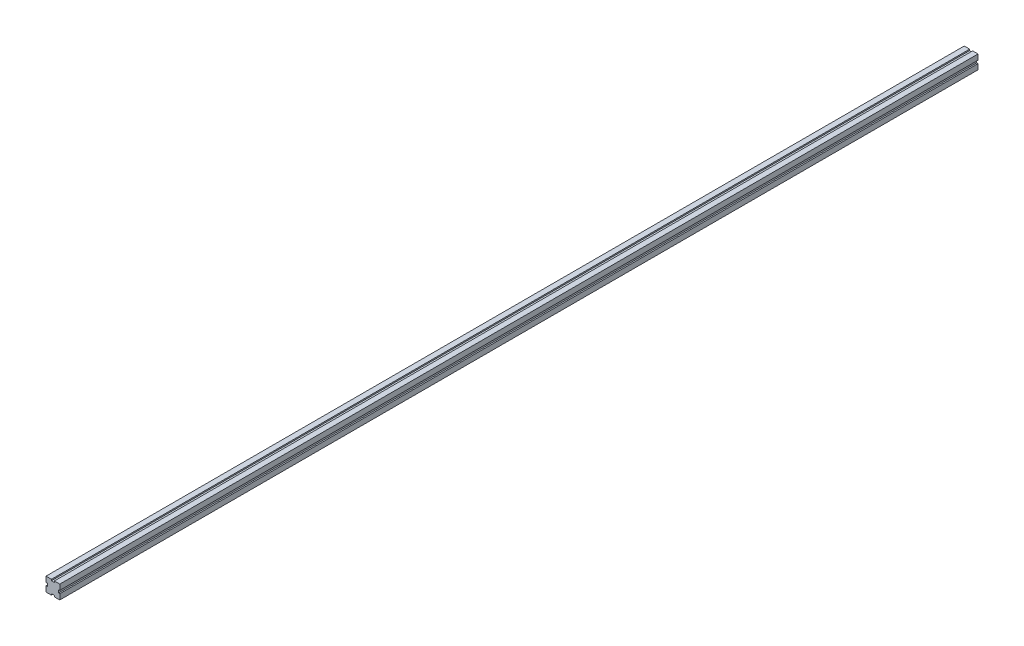
ISO-10303-21;
HEADER;
FILE_DESCRIPTION(('STEP AP214'),'2;1');
FILE_NAME('part.step','',(''),(''),'','','');
FILE_SCHEMA(('AUTOMOTIVE_DESIGN { 1 0 10303 214 1 1 1 1 }'));
ENDSEC;
DATA;
#1=APPLICATION_CONTEXT('core data for automotive mechanical design processes');
#2=APPLICATION_PROTOCOL_DEFINITION('international standard','automotive_design',2000,#1);
#3=PRODUCT_CONTEXT('',#1,'mechanical');
#4=PRODUCT('Part','Part','',(#3));
#5=PRODUCT_RELATED_PRODUCT_CATEGORY('part','',(#4));
#6=PRODUCT_DEFINITION_FORMATION('','',#4);
#7=PRODUCT_DEFINITION_CONTEXT('part definition',#1,'design');
#8=PRODUCT_DEFINITION('design','',#6,#7);
#9=PRODUCT_DEFINITION_SHAPE('','',#8);
#10=(LENGTH_UNIT() NAMED_UNIT(*) SI_UNIT(.MILLI.,.METRE.));
#11=(NAMED_UNIT(*) PLANE_ANGLE_UNIT() SI_UNIT($,.RADIAN.));
#12=(NAMED_UNIT(*) SI_UNIT($,.STERADIAN.) SOLID_ANGLE_UNIT());
#13=UNCERTAINTY_MEASURE_WITH_UNIT(LENGTH_MEASURE(1.E-05),#10,'distance_accuracy_value','');
#14=(GEOMETRIC_REPRESENTATION_CONTEXT(3) GLOBAL_UNCERTAINTY_ASSIGNED_CONTEXT((#13)) GLOBAL_UNIT_ASSIGNED_CONTEXT((#10,
#11,#12)) REPRESENTATION_CONTEXT('',''));
#15=CARTESIAN_POINT('',(0.,0.,0.));
#16=DIRECTION('',(0.,0.,1.));
#17=DIRECTION('',(1.,0.,0.));
#18=AXIS2_PLACEMENT_3D('',#15,#16,#17);
#19=CARTESIAN_POINT('',(-7.5,1.6,1000.));
#20=DIRECTION('',(1.,0.,0.));
#21=DIRECTION('',(0.,0.,-1.));
#22=AXIS2_PLACEMENT_3D('',#19,#20,#21);
#23=PLANE('',#22);
#24=DIRECTION('',(0.,-1.,0.));
#25=VECTOR('',#24,1.);
#26=CARTESIAN_POINT('',(-7.5,1.6,0.));
#27=LINE('',#26,#25);
#28=CARTESIAN_POINT('',(-7.5,7.5,0.));
#29=VERTEX_POINT('',#28);
#30=CARTESIAN_POINT('',(-7.5,1.6,0.));
#31=VERTEX_POINT('',#30);
#32=EDGE_CURVE('E201',#29,#31,#27,.T.);
#33=ORIENTED_EDGE('',*,*,#32,.T.);
#34=DIRECTION('',(0.,0.,-1.));
#35=VECTOR('',#34,1.);
#36=CARTESIAN_POINT('',(-7.5,1.6,1000.));
#37=LINE('',#36,#35);
#38=CARTESIAN_POINT('',(-7.5,1.6,1000.));
#39=VERTEX_POINT('',#38);
#40=EDGE_CURVE('E11',#39,#31,#37,.T.);
#41=ORIENTED_EDGE('',*,*,#40,.F.);
#42=DIRECTION('',(0.,-1.,0.));
#43=VECTOR('',#42,1.);
#44=CARTESIAN_POINT('',(-7.5,1.6,1000.));
#45=LINE('',#44,#43);
#46=CARTESIAN_POINT('',(-7.5,7.5,1000.));
#47=VERTEX_POINT('',#46);
#48=EDGE_CURVE('E240',#47,#39,#45,.T.);
#49=ORIENTED_EDGE('',*,*,#48,.F.);
#50=DIRECTION('',(0.,0.,-1.));
#51=VECTOR('',#50,1.);
#52=CARTESIAN_POINT('',(-7.5,7.5,1000.));
#53=LINE('',#52,#51);
#54=EDGE_CURVE('E197',#47,#29,#53,.T.);
#55=ORIENTED_EDGE('',*,*,#54,.T.);
#56=EDGE_LOOP('',(#33,#41,#49,#55));
#57=FACE_BOUND('',#56,.T.);
#58=ADVANCED_FACE('F33',(#57),#23,.F.);
#59=CARTESIAN_POINT('',(-6.1,1.6,1000.));
#60=DIRECTION('',(0.,1.,0.));
#61=DIRECTION('',(0.,0.,1.));
#62=AXIS2_PLACEMENT_3D('',#59,#60,#61);
#63=PLANE('',#62);
#64=DIRECTION('',(1.,0.,0.));
#65=VECTOR('',#64,1.);
#66=CARTESIAN_POINT('',(-6.1,1.6,0.));
#67=LINE('',#66,#65);
#68=CARTESIAN_POINT('',(-6.1,1.6,0.));
#69=VERTEX_POINT('',#68);
#70=EDGE_CURVE('E204',#31,#69,#67,.T.);
#71=ORIENTED_EDGE('',*,*,#70,.T.);
#72=DIRECTION('',(0.,0.,-1.));
#73=VECTOR('',#72,1.);
#74=CARTESIAN_POINT('',(-6.1,1.6,1000.));
#75=LINE('',#74,#73);
#76=CARTESIAN_POINT('',(-6.1,1.6,1000.));
#77=VERTEX_POINT('',#76);
#78=EDGE_CURVE('E41',#77,#69,#75,.T.);
#79=ORIENTED_EDGE('',*,*,#78,.F.);
#80=DIRECTION('',(1.,0.,0.));
#81=VECTOR('',#80,1.);
#82=CARTESIAN_POINT('',(-6.1,1.6,1000.));
#83=LINE('',#82,#81);
#84=EDGE_CURVE('E128',#39,#77,#83,.T.);
#85=ORIENTED_EDGE('',*,*,#84,.F.);
#86=ORIENTED_EDGE('',*,*,#40,.T.);
#87=EDGE_LOOP('',(#71,#79,#85,#86));
#88=FACE_BOUND('',#87,.T.);
#89=ADVANCED_FACE('F357',(#88),#63,.F.);
#90=CARTESIAN_POINT('',(-6.1,-1.6,1000.));
#91=DIRECTION('',(1.,0.,0.));
#92=DIRECTION('',(0.,0.,-1.));
#93=AXIS2_PLACEMENT_3D('',#90,#91,#92);
#94=PLANE('',#93);
#95=DIRECTION('',(0.,-1.,0.));
#96=VECTOR('',#95,1.);
#97=CARTESIAN_POINT('',(-6.1,-1.6,0.));
#98=LINE('',#97,#96);
#99=CARTESIAN_POINT('',(-6.1,-1.6,0.));
#100=VERTEX_POINT('',#99);
#101=EDGE_CURVE('E206',#69,#100,#98,.T.);
#102=ORIENTED_EDGE('',*,*,#101,.T.);
#103=DIRECTION('',(0.,0.,-1.));
#104=VECTOR('',#103,1.);
#105=CARTESIAN_POINT('',(-6.1,-1.6,1000.));
#106=LINE('',#105,#104);
#107=CARTESIAN_POINT('',(-6.1,-1.6,1000.));
#108=VERTEX_POINT('',#107);
#109=EDGE_CURVE('E283',#108,#100,#106,.T.);
#110=ORIENTED_EDGE('',*,*,#109,.F.);
#111=DIRECTION('',(0.,-1.,0.));
#112=VECTOR('',#111,1.);
#113=CARTESIAN_POINT('',(-6.1,-1.6,1000.));
#114=LINE('',#113,#112);
#115=EDGE_CURVE('E291',#77,#108,#114,.T.);
#116=ORIENTED_EDGE('',*,*,#115,.F.);
#117=ORIENTED_EDGE('',*,*,#78,.T.);
#118=EDGE_LOOP('',(#102,#110,#116,#117));
#119=FACE_BOUND('',#118,.T.);
#120=ADVANCED_FACE('F289',(#119),#94,.F.);
#121=CARTESIAN_POINT('',(-7.5,-1.6,1000.));
#122=DIRECTION('',(0.,-1.,0.));
#123=DIRECTION('',(0.,0.,-1.));
#124=AXIS2_PLACEMENT_3D('',#121,#122,#123);
#125=PLANE('',#124);
#126=DIRECTION('',(-1.,0.,0.));
#127=VECTOR('',#126,1.);
#128=CARTESIAN_POINT('',(-7.5,-1.6,0.));
#129=LINE('',#128,#127);
#130=CARTESIAN_POINT('',(-7.5,-1.6,0.));
#131=VERTEX_POINT('',#130);
#132=EDGE_CURVE('E208',#100,#131,#129,.T.);
#133=ORIENTED_EDGE('',*,*,#132,.T.);
#134=DIRECTION('',(0.,0.,-1.));
#135=VECTOR('',#134,1.);
#136=CARTESIAN_POINT('',(-7.5,-1.6,1000.));
#137=LINE('',#136,#135);
#138=CARTESIAN_POINT('',(-7.5,-1.6,1000.));
#139=VERTEX_POINT('',#138);
#140=EDGE_CURVE('E280',#139,#131,#137,.T.);
#141=ORIENTED_EDGE('',*,*,#140,.F.);
#142=DIRECTION('',(-1.,0.,0.));
#143=VECTOR('',#142,1.);
#144=CARTESIAN_POINT('',(-7.5,-1.6,1000.));
#145=LINE('',#144,#143);
#146=EDGE_CURVE('E309',#108,#139,#145,.T.);
#147=ORIENTED_EDGE('',*,*,#146,.F.);
#148=ORIENTED_EDGE('',*,*,#109,.T.);
#149=EDGE_LOOP('',(#133,#141,#147,#148));
#150=FACE_BOUND('',#149,.T.);
#151=ADVANCED_FACE('F300',(#150),#125,.F.);
#152=CARTESIAN_POINT('',(-7.5,-7.5,1000.));
#153=DIRECTION('',(1.,0.,0.));
#154=DIRECTION('',(0.,0.,-1.));
#155=AXIS2_PLACEMENT_3D('',#152,#153,#154);
#156=PLANE('',#155);
#157=DIRECTION('',(0.,-1.,0.));
#158=VECTOR('',#157,1.);
#159=CARTESIAN_POINT('',(-7.5,-7.5,0.));
#160=LINE('',#159,#158);
#161=CARTESIAN_POINT('',(-7.5,-7.5,0.));
#162=VERTEX_POINT('',#161);
#163=EDGE_CURVE('E210',#131,#162,#160,.T.);
#164=ORIENTED_EDGE('',*,*,#163,.T.);
#165=DIRECTION('',(0.,0.,-1.));
#166=VECTOR('',#165,1.);
#167=CARTESIAN_POINT('',(-7.5,-7.5,1000.));
#168=LINE('',#167,#166);
#169=CARTESIAN_POINT('',(-7.5,-7.5,1000.));
#170=VERTEX_POINT('',#169);
#171=EDGE_CURVE('E277',#170,#162,#168,.T.);
#172=ORIENTED_EDGE('',*,*,#171,.F.);
#173=DIRECTION('',(0.,-1.,0.));
#174=VECTOR('',#173,1.);
#175=CARTESIAN_POINT('',(-7.5,-7.5,1000.));
#176=LINE('',#175,#174);
#177=EDGE_CURVE('E306',#139,#170,#176,.T.);
#178=ORIENTED_EDGE('',*,*,#177,.F.);
#179=ORIENTED_EDGE('',*,*,#140,.T.);
#180=EDGE_LOOP('',(#164,#172,#178,#179));
#181=FACE_BOUND('',#180,.T.);
#182=ADVANCED_FACE('F304',(#181),#156,.F.);
#183=CARTESIAN_POINT('',(-1.6,-7.5,1000.));
#184=DIRECTION('',(0.,1.,0.));
#185=DIRECTION('',(0.,0.,1.));
#186=AXIS2_PLACEMENT_3D('',#183,#184,#185);
#187=PLANE('',#186);
#188=DIRECTION('',(1.,0.,0.));
#189=VECTOR('',#188,1.);
#190=CARTESIAN_POINT('',(-1.6,-7.5,0.));
#191=LINE('',#190,#189);
#192=CARTESIAN_POINT('',(-1.6,-7.5,0.));
#193=VERTEX_POINT('',#192);
#194=EDGE_CURVE('E212',#162,#193,#191,.T.);
#195=ORIENTED_EDGE('',*,*,#194,.T.);
#196=DIRECTION('',(0.,0.,-1.));
#197=VECTOR('',#196,1.);
#198=CARTESIAN_POINT('',(-1.6,-7.5,1000.));
#199=LINE('',#198,#197);
#200=CARTESIAN_POINT('',(-1.6,-7.5,1000.));
#201=VERTEX_POINT('',#200);
#202=EDGE_CURVE('E274',#201,#193,#199,.T.);
#203=ORIENTED_EDGE('',*,*,#202,.F.);
#204=DIRECTION('',(1.,0.,0.));
#205=VECTOR('',#204,1.);
#206=CARTESIAN_POINT('',(-1.6,-7.5,1000.));
#207=LINE('',#206,#205);
#208=EDGE_CURVE('E308',#170,#201,#207,.T.);
#209=ORIENTED_EDGE('',*,*,#208,.F.);
#210=ORIENTED_EDGE('',*,*,#171,.T.);
#211=EDGE_LOOP('',(#195,#203,#209,#210));
#212=FACE_BOUND('',#211,.T.);
#213=ADVANCED_FACE('F370',(#212),#187,.F.);
#214=CARTESIAN_POINT('',(-1.6,-6.09999999999998,1000.));
#215=DIRECTION('',(-1.,0.,0.));
#216=DIRECTION('',(0.,-1.,0.));
#217=AXIS2_PLACEMENT_3D('',#214,#215,#216);
#218=PLANE('',#217);
#219=DIRECTION('',(0.,1.,0.));
#220=VECTOR('',#219,1.);
#221=CARTESIAN_POINT('',(-1.6,-6.09999999999998,0.));
#222=LINE('',#221,#220);
#223=CARTESIAN_POINT('',(-1.6,-6.09999999999998,0.));
#224=VERTEX_POINT('',#223);
#225=EDGE_CURVE('E214',#193,#224,#222,.T.);
#226=ORIENTED_EDGE('',*,*,#225,.T.);
#227=DIRECTION('',(0.,0.,-1.));
#228=VECTOR('',#227,1.);
#229=CARTESIAN_POINT('',(-1.6,-6.09999999999998,1000.));
#230=LINE('',#229,#228);
#231=CARTESIAN_POINT('',(-1.6,-6.09999999999998,1000.));
#232=VERTEX_POINT('',#231);
#233=EDGE_CURVE('E271',#232,#224,#230,.T.);
#234=ORIENTED_EDGE('',*,*,#233,.F.);
#235=DIRECTION('',(0.,1.,0.));
#236=VECTOR('',#235,1.);
#237=CARTESIAN_POINT('',(-1.6,-6.09999999999998,1000.));
#238=LINE('',#237,#236);
#239=EDGE_CURVE('E311',#201,#232,#238,.T.);
#240=ORIENTED_EDGE('',*,*,#239,.F.);
#241=ORIENTED_EDGE('',*,*,#202,.T.);
#242=EDGE_LOOP('',(#226,#234,#240,#241));
#243=FACE_BOUND('',#242,.T.);
#244=ADVANCED_FACE('F373',(#243),#218,.F.);
#245=CARTESIAN_POINT('',(1.6,-6.09999999999997,1000.));
#246=DIRECTION('',(0.,1.,0.));
#247=DIRECTION('',(-1.,0.,0.));
#248=AXIS2_PLACEMENT_3D('',#245,#246,#247);
#249=PLANE('',#248);
#250=DIRECTION('',(1.,0.,0.));
#251=VECTOR('',#250,1.);
#252=CARTESIAN_POINT('',(1.6,-6.09999999999997,0.));
#253=LINE('',#252,#251);
#254=CARTESIAN_POINT('',(1.6,-6.09999999999997,0.));
#255=VERTEX_POINT('',#254);
#256=EDGE_CURVE('E216',#224,#255,#253,.T.);
#257=ORIENTED_EDGE('',*,*,#256,.T.);
#258=DIRECTION('',(0.,0.,-1.));
#259=VECTOR('',#258,1.);
#260=CARTESIAN_POINT('',(1.6,-6.09999999999997,1000.));
#261=LINE('',#260,#259);
#262=CARTESIAN_POINT('',(1.6,-6.09999999999997,1000.));
#263=VERTEX_POINT('',#262);
#264=EDGE_CURVE('E268',#263,#255,#261,.T.);
#265=ORIENTED_EDGE('',*,*,#264,.F.);
#266=DIRECTION('',(1.,0.,0.));
#267=VECTOR('',#266,1.);
#268=CARTESIAN_POINT('',(1.6,-6.09999999999997,1000.));
#269=LINE('',#268,#267);
#270=EDGE_CURVE('E317',#232,#263,#269,.T.);
#271=ORIENTED_EDGE('',*,*,#270,.F.);
#272=ORIENTED_EDGE('',*,*,#233,.T.);
#273=EDGE_LOOP('',(#257,#265,#271,#272));
#274=FACE_BOUND('',#273,.T.);
#275=ADVANCED_FACE('F377',(#274),#249,.F.);
#276=CARTESIAN_POINT('',(1.6,-7.5,1000.));
#277=DIRECTION('',(1.,0.,0.));
#278=DIRECTION('',(0.,1.,0.));
#279=AXIS2_PLACEMENT_3D('',#276,#277,#278);
#280=PLANE('',#279);
#281=DIRECTION('',(0.,-1.,0.));
#282=VECTOR('',#281,1.);
#283=CARTESIAN_POINT('',(1.6,-7.5,0.));
#284=LINE('',#283,#282);
#285=CARTESIAN_POINT('',(1.6,-7.5,0.));
#286=VERTEX_POINT('',#285);
#287=EDGE_CURVE('E218',#255,#286,#284,.T.);
#288=ORIENTED_EDGE('',*,*,#287,.T.);
#289=DIRECTION('',(0.,0.,-1.));
#290=VECTOR('',#289,1.);
#291=CARTESIAN_POINT('',(1.6,-7.5,1000.));
#292=LINE('',#291,#290);
#293=CARTESIAN_POINT('',(1.6,-7.5,1000.));
#294=VERTEX_POINT('',#293);
#295=EDGE_CURVE('E265',#294,#286,#292,.T.);
#296=ORIENTED_EDGE('',*,*,#295,.F.);
#297=DIRECTION('',(0.,-1.,0.));
#298=VECTOR('',#297,1.);
#299=CARTESIAN_POINT('',(1.6,-7.5,1000.));
#300=LINE('',#299,#298);
#301=EDGE_CURVE('E319',#263,#294,#300,.T.);
#302=ORIENTED_EDGE('',*,*,#301,.F.);
#303=ORIENTED_EDGE('',*,*,#264,.T.);
#304=EDGE_LOOP('',(#288,#296,#302,#303));
#305=FACE_BOUND('',#304,.T.);
#306=ADVANCED_FACE('F381',(#305),#280,.F.);
#307=CARTESIAN_POINT('',(7.5,-7.5,1000.));
#308=DIRECTION('',(0.,1.,0.));
#309=DIRECTION('',(0.,0.,1.));
#310=AXIS2_PLACEMENT_3D('',#307,#308,#309);
#311=PLANE('',#310);
#312=DIRECTION('',(1.,0.,0.));
#313=VECTOR('',#312,1.);
#314=CARTESIAN_POINT('',(7.5,-7.5,0.));
#315=LINE('',#314,#313);
#316=CARTESIAN_POINT('',(7.5,-7.5,0.));
#317=VERTEX_POINT('',#316);
#318=EDGE_CURVE('E220',#286,#317,#315,.T.);
#319=ORIENTED_EDGE('',*,*,#318,.T.);
#320=DIRECTION('',(0.,0.,-1.));
#321=VECTOR('',#320,1.);
#322=CARTESIAN_POINT('',(7.5,-7.5,1000.));
#323=LINE('',#322,#321);
#324=CARTESIAN_POINT('',(7.5,-7.5,1000.));
#325=VERTEX_POINT('',#324);
#326=EDGE_CURVE('E262',#325,#317,#323,.T.);
#327=ORIENTED_EDGE('',*,*,#326,.F.);
#328=DIRECTION('',(1.,0.,0.));
#329=VECTOR('',#328,1.);
#330=CARTESIAN_POINT('',(7.5,-7.5,1000.));
#331=LINE('',#330,#329);
#332=EDGE_CURVE('E321',#294,#325,#331,.T.);
#333=ORIENTED_EDGE('',*,*,#332,.F.);
#334=ORIENTED_EDGE('',*,*,#295,.T.);
#335=EDGE_LOOP('',(#319,#327,#333,#334));
#336=FACE_BOUND('',#335,.T.);
#337=ADVANCED_FACE('F385',(#336),#311,.F.);
#338=CARTESIAN_POINT('',(7.5,-1.60000000000004,1000.));
#339=DIRECTION('',(-1.,0.,0.));
#340=DIRECTION('',(0.,0.,1.));
#341=AXIS2_PLACEMENT_3D('',#338,#339,#340);
#342=PLANE('',#341);
#343=DIRECTION('',(0.,1.,0.));
#344=VECTOR('',#343,1.);
#345=CARTESIAN_POINT('',(7.5,-1.60000000000004,0.));
#346=LINE('',#345,#344);
#347=CARTESIAN_POINT('',(7.5,-1.60000000000004,0.));
#348=VERTEX_POINT('',#347);
#349=EDGE_CURVE('E222',#317,#348,#346,.T.);
#350=ORIENTED_EDGE('',*,*,#349,.T.);
#351=DIRECTION('',(0.,0.,-1.));
#352=VECTOR('',#351,1.);
#353=CARTESIAN_POINT('',(7.5,-1.60000000000004,1000.));
#354=LINE('',#353,#352);
#355=CARTESIAN_POINT('',(7.5,-1.60000000000004,1000.));
#356=VERTEX_POINT('',#355);
#357=EDGE_CURVE('E259',#356,#348,#354,.T.);
#358=ORIENTED_EDGE('',*,*,#357,.F.);
#359=DIRECTION('',(0.,1.,0.));
#360=VECTOR('',#359,1.);
#361=CARTESIAN_POINT('',(7.5,-1.60000000000004,1000.));
#362=LINE('',#361,#360);
#363=EDGE_CURVE('E323',#325,#356,#362,.T.);
#364=ORIENTED_EDGE('',*,*,#363,.F.);
#365=ORIENTED_EDGE('',*,*,#326,.T.);
#366=EDGE_LOOP('',(#350,#358,#364,#365));
#367=FACE_BOUND('',#366,.T.);
#368=ADVANCED_FACE('F389',(#367),#342,.F.);
#369=CARTESIAN_POINT('',(6.09999999999994,-1.60000000000004,1000.));
#370=DIRECTION('',(0.,-1.,0.));
#371=DIRECTION('',(1.,0.,0.));
#372=AXIS2_PLACEMENT_3D('',#369,#370,#371);
#373=PLANE('',#372);
#374=DIRECTION('',(-1.,0.,0.));
#375=VECTOR('',#374,1.);
#376=CARTESIAN_POINT('',(6.09999999999994,-1.60000000000004,0.));
#377=LINE('',#376,#375);
#378=CARTESIAN_POINT('',(6.09999999999994,-1.60000000000004,0.));
#379=VERTEX_POINT('',#378);
#380=EDGE_CURVE('E224',#348,#379,#377,.T.);
#381=ORIENTED_EDGE('',*,*,#380,.T.);
#382=DIRECTION('',(0.,0.,-1.));
#383=VECTOR('',#382,1.);
#384=CARTESIAN_POINT('',(6.09999999999994,-1.60000000000004,1000.));
#385=LINE('',#384,#383);
#386=CARTESIAN_POINT('',(6.09999999999994,-1.60000000000004,1000.));
#387=VERTEX_POINT('',#386);
#388=EDGE_CURVE('E256',#387,#379,#385,.T.);
#389=ORIENTED_EDGE('',*,*,#388,.F.);
#390=DIRECTION('',(-1.,0.,0.));
#391=VECTOR('',#390,1.);
#392=CARTESIAN_POINT('',(6.09999999999994,-1.60000000000004,1000.));
#393=LINE('',#392,#391);
#394=EDGE_CURVE('E325',#356,#387,#393,.T.);
#395=ORIENTED_EDGE('',*,*,#394,.F.);
#396=ORIENTED_EDGE('',*,*,#357,.T.);
#397=EDGE_LOOP('',(#381,#389,#395,#396));
#398=FACE_BOUND('',#397,.T.);
#399=ADVANCED_FACE('F393',(#398),#373,.F.);
#400=CARTESIAN_POINT('',(6.09999999999997,1.59999999999996,1000.));
#401=DIRECTION('',(-1.,0.,0.));
#402=DIRECTION('',(0.,-1.,0.));
#403=AXIS2_PLACEMENT_3D('',#400,#401,#402);
#404=PLANE('',#403);
#405=DIRECTION('',(0.,1.,0.));
#406=VECTOR('',#405,1.);
#407=CARTESIAN_POINT('',(6.09999999999997,1.59999999999996,0.));
#408=LINE('',#407,#406);
#409=CARTESIAN_POINT('',(6.09999999999997,1.59999999999996,0.));
#410=VERTEX_POINT('',#409);
#411=EDGE_CURVE('E226',#379,#410,#408,.T.);
#412=ORIENTED_EDGE('',*,*,#411,.T.);
#413=DIRECTION('',(0.,0.,-1.));
#414=VECTOR('',#413,1.);
#415=CARTESIAN_POINT('',(6.09999999999997,1.59999999999996,1000.));
#416=LINE('',#415,#414);
#417=CARTESIAN_POINT('',(6.09999999999997,1.59999999999996,1000.));
#418=VERTEX_POINT('',#417);
#419=EDGE_CURVE('E253',#418,#410,#416,.T.);
#420=ORIENTED_EDGE('',*,*,#419,.F.);
#421=DIRECTION('',(0.,1.,0.));
#422=VECTOR('',#421,1.);
#423=CARTESIAN_POINT('',(6.09999999999997,1.59999999999996,1000.));
#424=LINE('',#423,#422);
#425=EDGE_CURVE('E327',#387,#418,#424,.T.);
#426=ORIENTED_EDGE('',*,*,#425,.F.);
#427=ORIENTED_EDGE('',*,*,#388,.T.);
#428=EDGE_LOOP('',(#412,#420,#426,#427));
#429=FACE_BOUND('',#428,.T.);
#430=ADVANCED_FACE('F397',(#429),#404,.F.);
#431=CARTESIAN_POINT('',(7.5,1.59999999999996,1000.));
#432=DIRECTION('',(0.,1.,0.));
#433=DIRECTION('',(-1.,0.,0.));
#434=AXIS2_PLACEMENT_3D('',#431,#432,#433);
#435=PLANE('',#434);
#436=DIRECTION('',(1.,0.,0.));
#437=VECTOR('',#436,1.);
#438=CARTESIAN_POINT('',(7.5,1.59999999999996,0.));
#439=LINE('',#438,#437);
#440=CARTESIAN_POINT('',(7.5,1.59999999999996,0.));
#441=VERTEX_POINT('',#440);
#442=EDGE_CURVE('E228',#410,#441,#439,.T.);
#443=ORIENTED_EDGE('',*,*,#442,.T.);
#444=DIRECTION('',(0.,0.,-1.));
#445=VECTOR('',#444,1.);
#446=CARTESIAN_POINT('',(7.5,1.59999999999996,1000.));
#447=LINE('',#446,#445);
#448=CARTESIAN_POINT('',(7.5,1.59999999999996,1000.));
#449=VERTEX_POINT('',#448);
#450=EDGE_CURVE('E250',#449,#441,#447,.T.);
#451=ORIENTED_EDGE('',*,*,#450,.F.);
#452=DIRECTION('',(1.,0.,0.));
#453=VECTOR('',#452,1.);
#454=CARTESIAN_POINT('',(7.5,1.59999999999996,1000.));
#455=LINE('',#454,#453);
#456=EDGE_CURVE('E329',#418,#449,#455,.T.);
#457=ORIENTED_EDGE('',*,*,#456,.F.);
#458=ORIENTED_EDGE('',*,*,#419,.T.);
#459=EDGE_LOOP('',(#443,#451,#457,#458));
#460=FACE_BOUND('',#459,.T.);
#461=ADVANCED_FACE('F401',(#460),#435,.F.);
#462=CARTESIAN_POINT('',(7.5,7.5,1000.));
#463=DIRECTION('',(-1.,0.,0.));
#464=DIRECTION('',(0.,0.,1.));
#465=AXIS2_PLACEMENT_3D('',#462,#463,#464);
#466=PLANE('',#465);
#467=DIRECTION('',(0.,1.,0.));
#468=VECTOR('',#467,1.);
#469=CARTESIAN_POINT('',(7.5,7.5,0.));
#470=LINE('',#469,#468);
#471=CARTESIAN_POINT('',(7.5,7.5,0.));
#472=VERTEX_POINT('',#471);
#473=EDGE_CURVE('E230',#441,#472,#470,.T.);
#474=ORIENTED_EDGE('',*,*,#473,.T.);
#475=DIRECTION('',(0.,0.,-1.));
#476=VECTOR('',#475,1.);
#477=CARTESIAN_POINT('',(7.5,7.5,1000.));
#478=LINE('',#477,#476);
#479=CARTESIAN_POINT('',(7.5,7.5,1000.));
#480=VERTEX_POINT('',#479);
#481=EDGE_CURVE('E247',#480,#472,#478,.T.);
#482=ORIENTED_EDGE('',*,*,#481,.F.);
#483=DIRECTION('',(0.,1.,0.));
#484=VECTOR('',#483,1.);
#485=CARTESIAN_POINT('',(7.5,7.5,1000.));
#486=LINE('',#485,#484);
#487=EDGE_CURVE('E331',#449,#480,#486,.T.);
#488=ORIENTED_EDGE('',*,*,#487,.F.);
#489=ORIENTED_EDGE('',*,*,#450,.T.);
#490=EDGE_LOOP('',(#474,#482,#488,#489));
#491=FACE_BOUND('',#490,.T.);
#492=ADVANCED_FACE('F405',(#491),#466,.F.);
#493=CARTESIAN_POINT('',(1.6,7.5,1000.));
#494=DIRECTION('',(0.,-1.,0.));
#495=DIRECTION('',(0.,0.,-1.));
#496=AXIS2_PLACEMENT_3D('',#493,#494,#495);
#497=PLANE('',#496);
#498=DIRECTION('',(-1.,0.,0.));
#499=VECTOR('',#498,1.);
#500=CARTESIAN_POINT('',(1.6,7.5,0.));
#501=LINE('',#500,#499);
#502=CARTESIAN_POINT('',(1.6,7.5,0.));
#503=VERTEX_POINT('',#502);
#504=EDGE_CURVE('E233',#472,#503,#501,.T.);
#505=ORIENTED_EDGE('',*,*,#504,.T.);
#506=DIRECTION('',(0.,0.,-1.));
#507=VECTOR('',#506,1.);
#508=CARTESIAN_POINT('',(1.6,7.5,1000.));
#509=LINE('',#508,#507);
#510=CARTESIAN_POINT('',(1.6,7.5,1000.));
#511=VERTEX_POINT('',#510);
#512=EDGE_CURVE('E244',#511,#503,#509,.T.);
#513=ORIENTED_EDGE('',*,*,#512,.F.);
#514=DIRECTION('',(-1.,0.,0.));
#515=VECTOR('',#514,1.);
#516=CARTESIAN_POINT('',(4.4,7.5,1000.));
#517=LINE('',#516,#515);
#518=EDGE_CURVE('E333',#480,#511,#517,.T.);
#519=ORIENTED_EDGE('',*,*,#518,.F.);
#520=ORIENTED_EDGE('',*,*,#481,.T.);
#521=EDGE_LOOP('',(#505,#513,#519,#520));
#522=FACE_BOUND('',#521,.T.);
#523=ADVANCED_FACE('F339',(#522),#497,.F.);
#524=CARTESIAN_POINT('',(1.6,6.09999999999997,1000.));
#525=DIRECTION('',(1.,0.,0.));
#526=DIRECTION('',(0.,1.,0.));
#527=AXIS2_PLACEMENT_3D('',#524,#525,#526);
#528=PLANE('',#527);
#529=DIRECTION('',(0.,-1.,0.));
#530=VECTOR('',#529,1.);
#531=CARTESIAN_POINT('',(1.6,6.09999999999997,0.));
#532=LINE('',#531,#530);
#533=CARTESIAN_POINT('',(1.6,6.09999999999997,0.));
#534=VERTEX_POINT('',#533);
#535=EDGE_CURVE('E235',#503,#534,#532,.T.);
#536=ORIENTED_EDGE('',*,*,#535,.T.);
#537=DIRECTION('',(0.,0.,-1.));
#538=VECTOR('',#537,1.);
#539=CARTESIAN_POINT('',(1.6,6.09999999999997,1000.));
#540=LINE('',#539,#538);
#541=CARTESIAN_POINT('',(1.6,6.09999999999997,1000.));
#542=VERTEX_POINT('',#541);
#543=EDGE_CURVE('E192',#542,#534,#540,.T.);
#544=ORIENTED_EDGE('',*,*,#543,.F.);
#545=DIRECTION('',(0.,-1.,0.));
#546=VECTOR('',#545,1.);
#547=CARTESIAN_POINT('',(1.6,6.09999999999997,1000.));
#548=LINE('',#547,#546);
#549=EDGE_CURVE('E183',#511,#542,#548,.T.);
#550=ORIENTED_EDGE('',*,*,#549,.F.);
#551=ORIENTED_EDGE('',*,*,#512,.T.);
#552=EDGE_LOOP('',(#536,#544,#550,#551));
#553=FACE_BOUND('',#552,.T.);
#554=ADVANCED_FACE('F342',(#553),#528,.F.);
#555=CARTESIAN_POINT('',(-1.6,6.09999999999998,1000.));
#556=DIRECTION('',(0.,-1.,0.));
#557=DIRECTION('',(1.,0.,0.));
#558=AXIS2_PLACEMENT_3D('',#555,#556,#557);
#559=PLANE('',#558);
#560=DIRECTION('',(-1.,0.,0.));
#561=VECTOR('',#560,1.);
#562=CARTESIAN_POINT('',(-1.6,6.09999999999998,0.));
#563=LINE('',#562,#561);
#564=CARTESIAN_POINT('',(-1.6,6.09999999999998,0.));
#565=VERTEX_POINT('',#564);
#566=EDGE_CURVE('E191',#534,#565,#563,.T.);
#567=ORIENTED_EDGE('',*,*,#566,.T.);
#568=DIRECTION('',(0.,0.,-1.));
#569=VECTOR('',#568,1.);
#570=CARTESIAN_POINT('',(-1.6,6.09999999999998,1000.));
#571=LINE('',#570,#569);
#572=CARTESIAN_POINT('',(-1.6,6.09999999999998,1000.));
#573=VERTEX_POINT('',#572);
#574=EDGE_CURVE('E188',#573,#565,#571,.T.);
#575=ORIENTED_EDGE('',*,*,#574,.F.);
#576=DIRECTION('',(-1.,0.,0.));
#577=VECTOR('',#576,1.);
#578=CARTESIAN_POINT('',(-1.6,6.09999999999998,1000.));
#579=LINE('',#578,#577);
#580=EDGE_CURVE('E177',#542,#573,#579,.T.);
#581=ORIENTED_EDGE('',*,*,#580,.F.);
#582=ORIENTED_EDGE('',*,*,#543,.T.);
#583=EDGE_LOOP('',(#567,#575,#581,#582));
#584=FACE_BOUND('',#583,.T.);
#585=ADVANCED_FACE('F189',(#584),#559,.F.);
#586=CARTESIAN_POINT('',(-1.6,7.5,1000.));
#587=DIRECTION('',(-1.,0.,0.));
#588=DIRECTION('',(0.,-1.,0.));
#589=AXIS2_PLACEMENT_3D('',#586,#587,#588);
#590=PLANE('',#589);
#591=DIRECTION('',(0.,1.,0.));
#592=VECTOR('',#591,1.);
#593=CARTESIAN_POINT('',(-1.6,7.5,0.));
#594=LINE('',#593,#592);
#595=CARTESIAN_POINT('',(-1.6,7.5,0.));
#596=VERTEX_POINT('',#595);
#597=EDGE_CURVE('E114',#565,#596,#594,.T.);
#598=ORIENTED_EDGE('',*,*,#597,.T.);
#599=DIRECTION('',(0.,0.,-1.));
#600=VECTOR('',#599,1.);
#601=CARTESIAN_POINT('',(-1.6,7.5,1000.));
#602=LINE('',#601,#600);
#603=CARTESIAN_POINT('',(-1.6,7.5,1000.));
#604=VERTEX_POINT('',#603);
#605=EDGE_CURVE('E193',#604,#596,#602,.T.);
#606=ORIENTED_EDGE('',*,*,#605,.F.);
#607=DIRECTION('',(0.,1.,0.));
#608=VECTOR('',#607,1.);
#609=CARTESIAN_POINT('',(-1.6,7.5,1000.));
#610=LINE('',#609,#608);
#611=EDGE_CURVE('E181',#573,#604,#610,.T.);
#612=ORIENTED_EDGE('',*,*,#611,.F.);
#613=ORIENTED_EDGE('',*,*,#574,.T.);
#614=EDGE_LOOP('',(#598,#606,#612,#613));
#615=FACE_BOUND('',#614,.T.);
#616=ADVANCED_FACE('F195',(#615),#590,.F.);
#617=CARTESIAN_POINT('',(-7.5,7.5,1000.));
#618=DIRECTION('',(0.,-1.,0.));
#619=DIRECTION('',(0.,0.,-1.));
#620=AXIS2_PLACEMENT_3D('',#617,#618,#619);
#621=PLANE('',#620);
#622=DIRECTION('',(-1.,0.,0.));
#623=VECTOR('',#622,1.);
#624=CARTESIAN_POINT('',(-7.5,7.5,0.));
#625=LINE('',#624,#623);
#626=EDGE_CURVE('E120',#596,#29,#625,.T.);
#627=ORIENTED_EDGE('',*,*,#626,.T.);
#628=ORIENTED_EDGE('',*,*,#54,.F.);
#629=DIRECTION('',(-1.,0.,0.));
#630=VECTOR('',#629,1.);
#631=CARTESIAN_POINT('',(-7.5,7.5,1000.));
#632=LINE('',#631,#630);
#633=EDGE_CURVE('E49',#604,#47,#632,.T.);
#634=ORIENTED_EDGE('',*,*,#633,.F.);
#635=ORIENTED_EDGE('',*,*,#605,.T.);
#636=EDGE_LOOP('',(#627,#628,#634,#635));
#637=FACE_BOUND('',#636,.T.);
#638=ADVANCED_FACE('F346',(#637),#621,.F.);
#639=CARTESIAN_POINT('',(0.,0.,1000.));
#640=DIRECTION('',(0.,0.,-1.));
#641=DIRECTION('',(-1.,0.,0.));
#642=AXIS2_PLACEMENT_3D('',#639,#640,#641);
#643=PLANE('',#642);
#644=ORIENTED_EDGE('',*,*,#48,.T.);
#645=ORIENTED_EDGE('',*,*,#84,.T.);
#646=ORIENTED_EDGE('',*,*,#115,.T.);
#647=ORIENTED_EDGE('',*,*,#146,.T.);
#648=ORIENTED_EDGE('',*,*,#177,.T.);
#649=ORIENTED_EDGE('',*,*,#208,.T.);
#650=ORIENTED_EDGE('',*,*,#239,.T.);
#651=ORIENTED_EDGE('',*,*,#270,.T.);
#652=ORIENTED_EDGE('',*,*,#301,.T.);
#653=ORIENTED_EDGE('',*,*,#332,.T.);
#654=ORIENTED_EDGE('',*,*,#363,.T.);
#655=ORIENTED_EDGE('',*,*,#394,.T.);
#656=ORIENTED_EDGE('',*,*,#425,.T.);
#657=ORIENTED_EDGE('',*,*,#456,.T.);
#658=ORIENTED_EDGE('',*,*,#487,.T.);
#659=ORIENTED_EDGE('',*,*,#518,.T.);
#660=ORIENTED_EDGE('',*,*,#549,.T.);
#661=ORIENTED_EDGE('',*,*,#580,.T.);
#662=ORIENTED_EDGE('',*,*,#611,.T.);
#663=ORIENTED_EDGE('',*,*,#633,.T.);
#664=EDGE_LOOP('',(#644,#645,#646,#647,#648,#649,#650,#651,#652,#653,#654,#655,#656,#657,#658,
#659,#660,#661,#662,#663));
#665=FACE_BOUND('',#664,.T.);
#666=ADVANCED_FACE('F179',(#665),#643,.F.);
#667=CARTESIAN_POINT('',(0.,0.,0.));
#668=DIRECTION('',(0.,0.,-1.));
#669=DIRECTION('',(-1.,0.,0.));
#670=AXIS2_PLACEMENT_3D('',#667,#668,#669);
#671=PLANE('',#670);
#672=ORIENTED_EDGE('',*,*,#32,.F.);
#673=ORIENTED_EDGE('',*,*,#626,.F.);
#674=ORIENTED_EDGE('',*,*,#597,.F.);
#675=ORIENTED_EDGE('',*,*,#566,.F.);
#676=ORIENTED_EDGE('',*,*,#535,.F.);
#677=ORIENTED_EDGE('',*,*,#504,.F.);
#678=ORIENTED_EDGE('',*,*,#473,.F.);
#679=ORIENTED_EDGE('',*,*,#442,.F.);
#680=ORIENTED_EDGE('',*,*,#411,.F.);
#681=ORIENTED_EDGE('',*,*,#380,.F.);
#682=ORIENTED_EDGE('',*,*,#349,.F.);
#683=ORIENTED_EDGE('',*,*,#318,.F.);
#684=ORIENTED_EDGE('',*,*,#287,.F.);
#685=ORIENTED_EDGE('',*,*,#256,.F.);
#686=ORIENTED_EDGE('',*,*,#225,.F.);
#687=ORIENTED_EDGE('',*,*,#194,.F.);
#688=ORIENTED_EDGE('',*,*,#163,.F.);
#689=ORIENTED_EDGE('',*,*,#132,.F.);
#690=ORIENTED_EDGE('',*,*,#101,.F.);
#691=ORIENTED_EDGE('',*,*,#70,.F.);
#692=EDGE_LOOP('',(#672,#673,#674,#675,#676,#677,#678,#679,#680,#681,#682,#683,#684,#685,#686,
#687,#688,#689,#690,#691));
#693=FACE_BOUND('',#692,.T.);
#694=ADVANCED_FACE('F295',(#693),#671,.T.);
#695=CLOSED_SHELL('',(#58,#89,#120,#151,#182,#213,#244,#275,#306,#337,#368,#399,#430,#461,#492,
#523,#554,#585,#616,#638,#666,#694));
#696=MANIFOLD_SOLID_BREP('B2',#695);
#697=ADVANCED_BREP_SHAPE_REPRESENTATION('',(#18,#696),#14);
#698=SHAPE_DEFINITION_REPRESENTATION(#9,#697);
ENDSEC;
END-ISO-10303-21;
